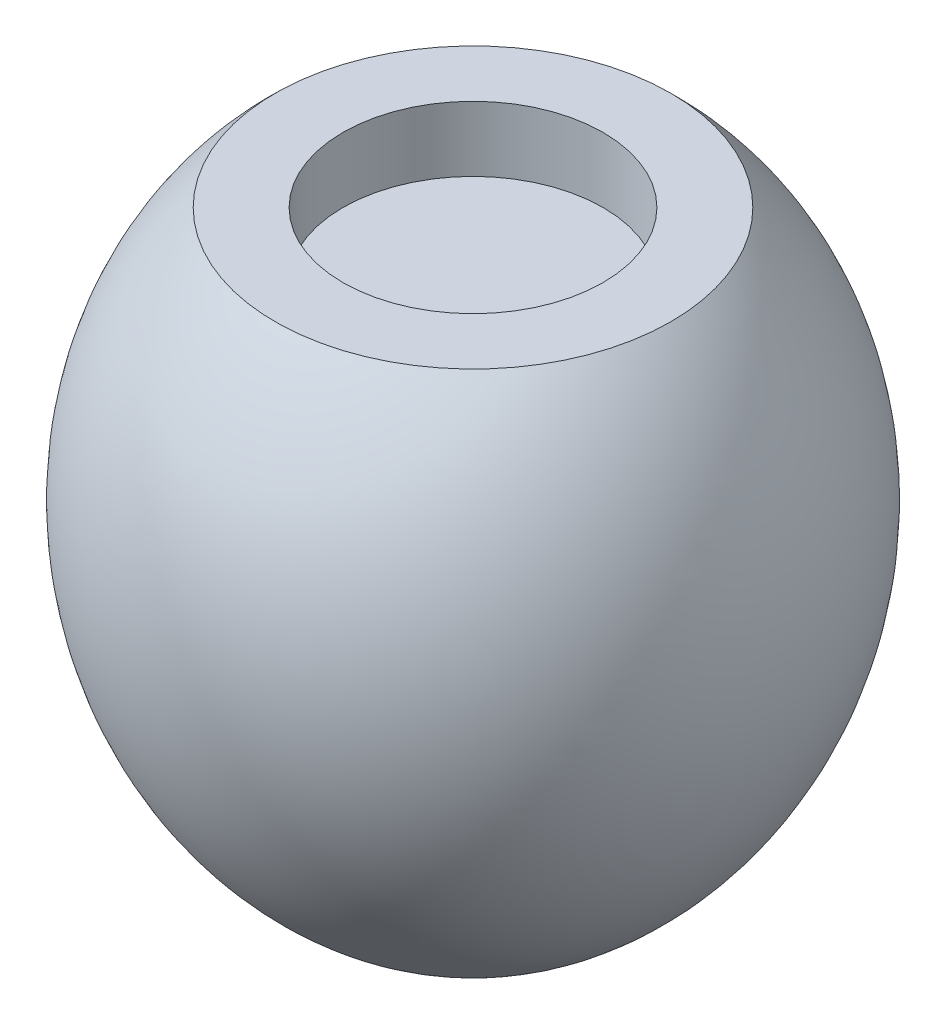
ISO-10303-21;
HEADER;
FILE_DESCRIPTION(('STEP AP214'),'2;1');
FILE_NAME('part.step','',(''),(''),'','','');
FILE_SCHEMA(('AUTOMOTIVE_DESIGN { 1 0 10303 214 1 1 1 1 }'));
ENDSEC;
DATA;
#1=APPLICATION_CONTEXT('core data for automotive mechanical design processes');
#2=APPLICATION_PROTOCOL_DEFINITION('international standard','automotive_design',2000,#1);
#3=PRODUCT_CONTEXT('',#1,'mechanical');
#4=PRODUCT('Part','Part','',(#3));
#5=PRODUCT_RELATED_PRODUCT_CATEGORY('part','',(#4));
#6=PRODUCT_DEFINITION_FORMATION('','',#4);
#7=PRODUCT_DEFINITION_CONTEXT('part definition',#1,'design');
#8=PRODUCT_DEFINITION('design','',#6,#7);
#9=PRODUCT_DEFINITION_SHAPE('','',#8);
#10=(LENGTH_UNIT() NAMED_UNIT(*) SI_UNIT(.MILLI.,.METRE.));
#11=(NAMED_UNIT(*) PLANE_ANGLE_UNIT() SI_UNIT($,.RADIAN.));
#12=(NAMED_UNIT(*) SI_UNIT($,.STERADIAN.) SOLID_ANGLE_UNIT());
#13=UNCERTAINTY_MEASURE_WITH_UNIT(LENGTH_MEASURE(1.E-05),#10,'distance_accuracy_value','');
#14=(GEOMETRIC_REPRESENTATION_CONTEXT(3) GLOBAL_UNCERTAINTY_ASSIGNED_CONTEXT((#13)) GLOBAL_UNIT_ASSIGNED_CONTEXT((#10,
#11,#12)) REPRESENTATION_CONTEXT('',''));
#15=CARTESIAN_POINT('',(0.,0.,0.));
#16=DIRECTION('',(0.,0.,1.));
#17=DIRECTION('',(1.,0.,0.));
#18=AXIS2_PLACEMENT_3D('',#15,#16,#17);
#19=CARTESIAN_POINT('',(-9.02064160134579E-09,3.1816759286215E-09,0.));
#20=CARTESIAN_POINT('',(0.0919895729443937,-0.0302149336545484,0.));
#21=CARTESIAN_POINT('',(0.276985160327375,-0.0872521054657558,0.));
#22=CARTESIAN_POINT('',(0.651025601425253,-0.187798966696515,0.));
#23=CARTESIAN_POINT('',(1.12269819844917,-0.296732641462193,0.));
#24=CARTESIAN_POINT('',(1.78687975458292,-0.431368155203873,0.));
#25=CARTESIAN_POINT('',(2.74162501986766,-0.592094226334403,0.));
#26=CARTESIAN_POINT('',(3.89368650964849,-0.743441748074737,0.));
#27=CARTESIAN_POINT('',(5.3828970604025,-0.878736697370538,0.));
#28=CARTESIAN_POINT('',(7.0157139190803,-0.964240306474483,0.));
#29=CARTESIAN_POINT('',(8.69341162135753,-0.993855838084443,0.));
#30=CARTESIAN_POINT('',(10.4140724243929,-0.969044452293767,0.));
#31=CARTESIAN_POINT('',(12.940843471997,-0.858456297153208,0.));
#32=CARTESIAN_POINT('',(16.2666344528607,-0.565795725635427,0.));
#33=CARTESIAN_POINT('',(20.4501342043987,0.0295210109739374,0.));
#34=CARTESIAN_POINT('',(25.4572202949051,1.05707472621122,0.));
#35=CARTESIAN_POINT('',(30.473634045075,2.38234925124876,0.));
#36=CARTESIAN_POINT('',(35.4876157904692,3.9907421203627,0.));
#37=CARTESIAN_POINT('',(40.4176259866832,5.8396870632358,0.));
#38=CARTESIAN_POINT('',(45.2583222034429,7.91073025472049,0.));
#39=CARTESIAN_POINT('',(51.9288529799939,11.1111375340293,0.));
#40=CARTESIAN_POINT('',(61.8351189688833,16.6607159377781,0.));
#41=CARTESIAN_POINT('',(74.4218570595126,25.4106417702472,0.));
#42=CARTESIAN_POINT('',(88.8023728553696,38.2750700488586,0.));
#43=CARTESIAN_POINT('',(102.610809616223,54.2394111948669,0.));
#44=CARTESIAN_POINT('',(114.380492331146,71.7558431189886,0.));
#45=CARTESIAN_POINT('',(124.012069939433,90.5304655968965,0.));
#46=CARTESIAN_POINT('',(130.488447554441,107.819733575913,0.));
#47=CARTESIAN_POINT('',(134.592531575903,123.088241118437,0.));
#48=CARTESIAN_POINT('',(137.023436310791,136.027627029394,0.));
#49=CARTESIAN_POINT('',(138.365467235831,146.474444178929,0.));
#50=CARTESIAN_POINT('',(139.096219756259,156.98182399063,0.));
#51=CARTESIAN_POINT('',(139.207889834686,167.514102999382,0.));
#52=CARTESIAN_POINT('',(138.693565855039,178.034552359664,0.));
#53=CARTESIAN_POINT('',(137.547432357181,188.505187397892,0.));
#54=CARTESIAN_POINT('',(135.764966432317,198.88664432866,0.));
#55=CARTESIAN_POINT('',(133.343198251097,209.13805259877,0.));
#56=CARTESIAN_POINT('',(130.280993262746,219.216953733366,0.));
#57=CARTESIAN_POINT('',(126.579382252238,229.079252776955,0.));
#58=CARTESIAN_POINT('',(122.784110510932,237.479223571644,0.));
#59=CARTESIAN_POINT('',(119.441545144121,243.90181003839,0.));
#60=CARTESIAN_POINT('',(116.829197832421,248.471805700559,0.));
#61=CARTESIAN_POINT('',(115.132149087322,251.290070823472,0.));
#62=CARTESIAN_POINT('',(113.736126906298,253.521102102436,0.));
#63=CARTESIAN_POINT('',(112.301898628909,255.727808502877,0.));
#64=CARTESIAN_POINT('',(110.829765162762,257.909339257172,0.));
#65=CARTESIAN_POINT('',(109.319853588063,260.065021840011,0.));
#66=CARTESIAN_POINT('',(107.772630662674,262.193872296983,0.));
#67=CARTESIAN_POINT('',(106.188040412183,264.295420015974,0.));
#68=CARTESIAN_POINT('',(104.566957609198,266.368319848878,0.));
#69=CARTESIAN_POINT('',(103.115952966282,268.157206700425,0.));
#70=CARTESIAN_POINT('',(101.850548571772,269.670954859716,0.));
#71=CARTESIAN_POINT('',(100.779582664981,270.921128035513,0.));
#72=CARTESIAN_POINT('',(99.916536979227,271.910996123083,0.));
#73=CARTESIAN_POINT('',(99.0392085271871,272.898191983706,0.));
#74=CARTESIAN_POINT('',(98.1626101786328,273.868316913903,0.));
#75=CARTESIAN_POINT('',(97.2610438180522,274.845872730424,0.));
#76=CARTESIAN_POINT('',(96.3774564647715,275.789772177133,0.));
#77=CARTESIAN_POINT('',(95.4428981626205,276.765771151537,0.));
#78=CARTESIAN_POINT('',(94.5661599967783,277.669921291071,0.));
#79=CARTESIAN_POINT('',(93.5839515648378,278.658249353166,0.));
#80=CARTESIAN_POINT('',(92.7477431021319,279.49048058174,0.));
#81=CARTESIAN_POINT('',(91.9235309096582,280.290495928694,0.));
#82=CARTESIAN_POINT('',(91.4897850564285,280.707715471515,0.));
#83=CARTESIAN_POINT('',(91.2743497558321,280.913563574228,0.));
#84=B_SPLINE_CURVE_WITH_KNOTS('',4,(#19,#20,#21,#22,#23,#24,#25,#26,#27,#28,#29,#30,#31,#32,#33,
#34,#35,#36,#37,#38,#39,#40,#41,#42,#43,#44,#45,#46,#47,#48,#49,#50,#51,#52,#53,#54,#55,#56,#57,
#58,#59,#60,#61,#62,#63,#64,#65,#66,#67,#68,#69,#70,#71,#72,#73,#74,#75,#76,#77,#78,#79,#80,#81,
#82,#83),.UNSPECIFIED.,.F.,.F.,(5,1,1,1,1,1,1,1,1,1,1,1,1,1,1,1,1,1,1,1,1,1,1,1,1,1,1,1,1,1,1,1,
1,1,1,1,1,1,1,1,1,1,1,1,1,1,1,1,1,1,1,1,1,1,1,1,1,1,1,1,1,5),(0.,0.000955617203619004,
0.00191123440723801,0.00382246881447601,0.00477808601809502,0.00764493762895203,
0.011467406443428,0.0152898752579041,0.0195362686625174,0.0237826620671308,0.0280290554717442,
0.0322754488763576,0.0445010014893165,0.0567265541022754,0.0697167832980973,0.0827070124939191,
0.0956970841725638,0.108687155851209,0.121677227709757,0.134667299568306,0.168714412930418,
0.22067448184913,0.272634490893054,0.324594549483768,0.376554581413197,0.428514577807029,
0.480474525779837,0.506454548806797,0.532434571833758,0.558414577262192,0.584394582690625,
0.610374588662463,0.6363545946343,0.662334599369199,0.688314604104098,0.714294610413489,
0.740274616722881,0.766254617566215,0.79223461840955,0.805224617532564,0.811719617094071,
0.818214616655578,0.824709616217085,0.831204615778593,0.8376996153401,0.844194614901607,
0.850689614063246,0.857184613224885,0.863679612386524,0.870174611548163,0.873422111128982,
0.876669610709802,0.879917110290621,0.883164609871441,0.88641210945226,0.88965960903308,
0.892907108613899,0.896154608194718,0.899390298089957,0.902625987985196,0.905861677880435,
0.909097367775674),.UNSPECIFIED.);
#85=CARTESIAN_POINT('',(-9.02064534180624E-09,3.18167714397077E-09,0.));
#86=DIRECTION('',(0.,-1.,0.));
#87=AXIS1_PLACEMENT('',#85,#86);
#88=SURFACE_OF_REVOLUTION('',#84,#87);
#89=CARTESIAN_POINT('',(-9.02064534180624E-09,280.913563574418,0.));
#90=DIRECTION('',(0.,-1.,0.));
#91=DIRECTION('',(0.,0.,-1.));
#92=AXIS2_PLACEMENT_3D('',#89,#90,#91);
#93=CIRCLE('',#92,91.2743497642689);
#94=CARTESIAN_POINT('',(-9.02064534180624E-09,280.913563574418,-91.2743497642689));
#95=VERTEX_POINT('',#94);
#96=EDGE_CURVE('E11',#95,#95,#93,.T.);
#97=ORIENTED_EDGE('',*,*,#96,.T.);
#98=EDGE_LOOP('',(#97));
#99=FACE_BOUND('',#98,.T.);
#100=CARTESIAN_POINT('',(-9.02064534180624E-09,3.18167714397077E-09,0.));
#101=VERTEX_POINT('',#100);
#102=VERTEX_LOOP('',#101);
#103=FACE_BOUND('',#102,.T.);
#104=ADVANCED_FACE('F42',(#99,#103),#88,.F.);
#105=CARTESIAN_POINT('',(91.2743497552483,280.913563574418,0.));
#106=DIRECTION('',(0.,1.,0.));
#107=DIRECTION('',(0.,0.,1.));
#108=AXIS2_PLACEMENT_3D('',#105,#106,#107);
#109=PLANE('',#108);
#110=CARTESIAN_POINT('',(0.,280.913563574418,0.));
#111=DIRECTION('',(0.,1.,0.));
#112=DIRECTION('',(0.,0.,1.));
#113=AXIS2_PLACEMENT_3D('',#110,#111,#112);
#114=CIRCLE('',#113,60.);
#115=CARTESIAN_POINT('',(0.,280.913563574418,60.));
#116=VERTEX_POINT('',#115);
#117=EDGE_CURVE('E78',#116,#116,#114,.T.);
#118=ORIENTED_EDGE('',*,*,#117,.F.);
#119=EDGE_LOOP('',(#118));
#120=FACE_BOUND('',#119,.T.);
#121=ORIENTED_EDGE('',*,*,#96,.F.);
#122=EDGE_LOOP('',(#121));
#123=FACE_BOUND('',#122,.T.);
#124=ADVANCED_FACE('F53',(#120,#123),#109,.T.);
#125=CARTESIAN_POINT('',(0.,250.913563574418,0.));
#126=DIRECTION('',(0.,1.,0.));
#127=DIRECTION('',(0.,0.,1.));
#128=AXIS2_PLACEMENT_3D('',#125,#126,#127);
#129=CYLINDRICAL_SURFACE('',#128,60.);
#130=CARTESIAN_POINT('',(0.,250.913563574418,0.));
#131=DIRECTION('',(0.,1.,0.));
#132=DIRECTION('',(0.,0.,1.));
#133=AXIS2_PLACEMENT_3D('',#130,#131,#132);
#134=CIRCLE('',#133,60.);
#135=CARTESIAN_POINT('',(0.,250.913563574418,60.));
#136=VERTEX_POINT('',#135);
#137=EDGE_CURVE('E49',#136,#136,#134,.T.);
#138=ORIENTED_EDGE('',*,*,#137,.F.);
#139=EDGE_LOOP('',(#138));
#140=FACE_BOUND('',#139,.T.);
#141=ORIENTED_EDGE('',*,*,#117,.T.);
#142=EDGE_LOOP('',(#141));
#143=FACE_BOUND('',#142,.T.);
#144=ADVANCED_FACE('F59',(#140,#143),#129,.F.);
#145=CARTESIAN_POINT('',(0.,250.913563574418,0.));
#146=DIRECTION('',(0.,1.,0.));
#147=DIRECTION('',(0.,0.,1.));
#148=AXIS2_PLACEMENT_3D('',#145,#146,#147);
#149=PLANE('',#148);
#150=ORIENTED_EDGE('',*,*,#137,.T.);
#151=EDGE_LOOP('',(#150));
#152=FACE_BOUND('',#151,.T.);
#153=ADVANCED_FACE('F66',(#152),#149,.T.);
#154=CLOSED_SHELL('',(#104,#124,#144,#153));
#155=MANIFOLD_SOLID_BREP('B2',#154);
#156=ADVANCED_BREP_SHAPE_REPRESENTATION('',(#18,#155),#14);
#157=SHAPE_DEFINITION_REPRESENTATION(#9,#156);
ENDSEC;
END-ISO-10303-21;
